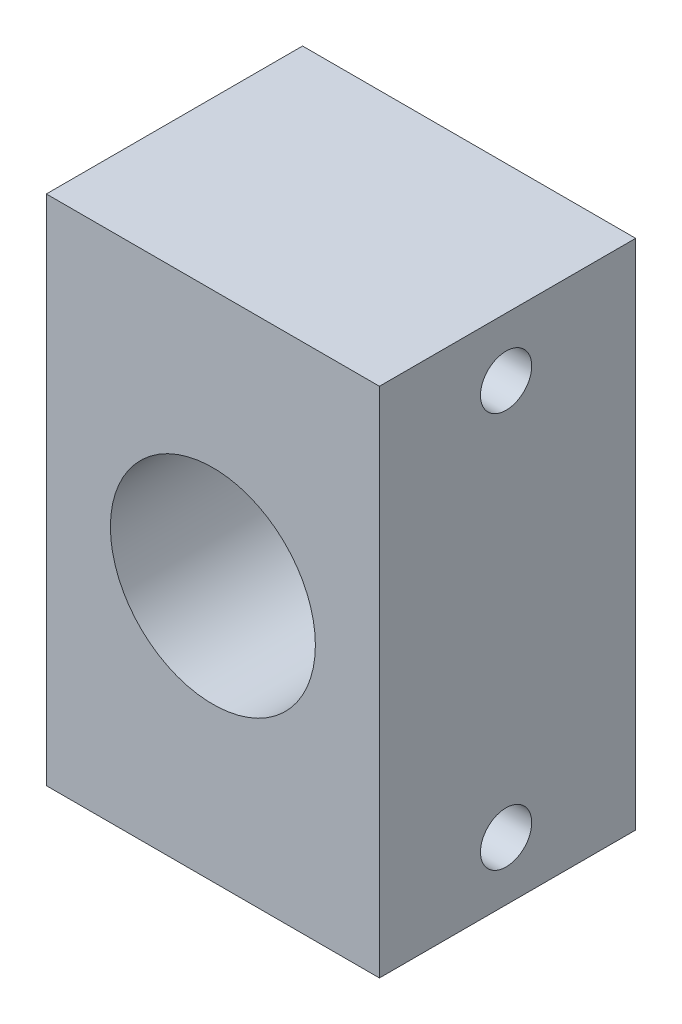
ISO-10303-21;
HEADER;
FILE_DESCRIPTION(('STEP AP214'),'2;1');
FILE_NAME('part.step','',(''),(''),'','','');
FILE_SCHEMA(('AUTOMOTIVE_DESIGN { 1 0 10303 214 1 1 1 1 }'));
ENDSEC;
DATA;
#1=APPLICATION_CONTEXT('core data for automotive mechanical design processes');
#2=APPLICATION_PROTOCOL_DEFINITION('international standard','automotive_design',2000,#1);
#3=PRODUCT_CONTEXT('',#1,'mechanical');
#4=PRODUCT('Part','Part','',(#3));
#5=PRODUCT_RELATED_PRODUCT_CATEGORY('part','',(#4));
#6=PRODUCT_DEFINITION_FORMATION('','',#4);
#7=PRODUCT_DEFINITION_CONTEXT('part definition',#1,'design');
#8=PRODUCT_DEFINITION('design','',#6,#7);
#9=PRODUCT_DEFINITION_SHAPE('','',#8);
#10=(LENGTH_UNIT() NAMED_UNIT(*) SI_UNIT(.MILLI.,.METRE.));
#11=(NAMED_UNIT(*) PLANE_ANGLE_UNIT() SI_UNIT($,.RADIAN.));
#12=(NAMED_UNIT(*) SI_UNIT($,.STERADIAN.) SOLID_ANGLE_UNIT());
#13=UNCERTAINTY_MEASURE_WITH_UNIT(LENGTH_MEASURE(1.E-05),#10,'distance_accuracy_value','');
#14=(GEOMETRIC_REPRESENTATION_CONTEXT(3) GLOBAL_UNCERTAINTY_ASSIGNED_CONTEXT((#13)) GLOBAL_UNIT_ASSIGNED_CONTEXT((#10,
#11,#12)) REPRESENTATION_CONTEXT('',''));
#15=CARTESIAN_POINT('',(0.,0.,0.));
#16=DIRECTION('',(0.,0.,1.));
#17=DIRECTION('',(1.,0.,0.));
#18=AXIS2_PLACEMENT_3D('',#15,#16,#17);
#19=CARTESIAN_POINT('',(0.,0.,10.));
#20=DIRECTION('',(0.,0.,1.));
#21=DIRECTION('',(1.,0.,0.));
#22=AXIS2_PLACEMENT_3D('',#19,#20,#21);
#23=PLANE('',#22);
#24=DIRECTION('',(0.,-1.,0.));
#25=VECTOR('',#24,1.);
#26=CARTESIAN_POINT('',(-6.5,-10.,10.));
#27=LINE('',#26,#25);
#28=CARTESIAN_POINT('',(-6.5,10.,10.));
#29=VERTEX_POINT('',#28);
#30=CARTESIAN_POINT('',(-6.5,-10.,10.));
#31=VERTEX_POINT('',#30);
#32=EDGE_CURVE('E87',#29,#31,#27,.T.);
#33=ORIENTED_EDGE('',*,*,#32,.T.);
#34=DIRECTION('',(1.,0.,0.));
#35=VECTOR('',#34,1.);
#36=CARTESIAN_POINT('',(6.5,-10.,10.));
#37=LINE('',#36,#35);
#38=CARTESIAN_POINT('',(6.5,-10.,10.));
#39=VERTEX_POINT('',#38);
#40=EDGE_CURVE('E82',#31,#39,#37,.T.);
#41=ORIENTED_EDGE('',*,*,#40,.T.);
#42=DIRECTION('',(0.,1.,0.));
#43=VECTOR('',#42,1.);
#44=CARTESIAN_POINT('',(6.5,-10.,10.));
#45=LINE('',#44,#43);
#46=CARTESIAN_POINT('',(6.5,10.,10.));
#47=VERTEX_POINT('',#46);
#48=EDGE_CURVE('E85',#39,#47,#45,.T.);
#49=ORIENTED_EDGE('',*,*,#48,.T.);
#50=DIRECTION('',(-1.,0.,0.));
#51=VECTOR('',#50,1.);
#52=CARTESIAN_POINT('',(6.5,10.,10.));
#53=LINE('',#52,#51);
#54=EDGE_CURVE('E52',#47,#29,#53,.T.);
#55=ORIENTED_EDGE('',*,*,#54,.T.);
#56=EDGE_LOOP('',(#33,#41,#49,#55));
#57=FACE_BOUND('',#56,.T.);
#58=CARTESIAN_POINT('',(0.,0.,10.));
#59=DIRECTION('',(0.,0.,1.));
#60=DIRECTION('',(1.,0.,0.));
#61=AXIS2_PLACEMENT_3D('',#58,#59,#60);
#62=CIRCLE('',#61,4.);
#63=CARTESIAN_POINT('',(4.,0.,10.));
#64=VERTEX_POINT('',#63);
#65=EDGE_CURVE('E102',#64,#64,#62,.T.);
#66=ORIENTED_EDGE('',*,*,#65,.F.);
#67=EDGE_LOOP('',(#66));
#68=FACE_BOUND('',#67,.T.);
#69=ADVANCED_FACE('F35',(#57,#68),#23,.T.);
#70=CARTESIAN_POINT('',(0.,0.,0.));
#71=DIRECTION('',(0.,0.,1.));
#72=DIRECTION('',(1.,0.,0.));
#73=AXIS2_PLACEMENT_3D('',#70,#71,#72);
#74=PLANE('',#73);
#75=DIRECTION('',(0.,-1.,0.));
#76=VECTOR('',#75,1.);
#77=CARTESIAN_POINT('',(-6.5,-10.,0.));
#78=LINE('',#77,#76);
#79=CARTESIAN_POINT('',(-6.5,10.,0.));
#80=VERTEX_POINT('',#79);
#81=CARTESIAN_POINT('',(-6.5,-10.,0.));
#82=VERTEX_POINT('',#81);
#83=EDGE_CURVE('E99',#80,#82,#78,.T.);
#84=ORIENTED_EDGE('',*,*,#83,.F.);
#85=DIRECTION('',(-1.,0.,0.));
#86=VECTOR('',#85,1.);
#87=CARTESIAN_POINT('',(6.5,10.,0.));
#88=LINE('',#87,#86);
#89=CARTESIAN_POINT('',(6.5,10.,0.));
#90=VERTEX_POINT('',#89);
#91=EDGE_CURVE('E75',#90,#80,#88,.T.);
#92=ORIENTED_EDGE('',*,*,#91,.F.);
#93=DIRECTION('',(0.,1.,0.));
#94=VECTOR('',#93,1.);
#95=CARTESIAN_POINT('',(6.5,-10.,0.));
#96=LINE('',#95,#94);
#97=CARTESIAN_POINT('',(6.5,-10.,0.));
#98=VERTEX_POINT('',#97);
#99=EDGE_CURVE('E69',#98,#90,#96,.T.);
#100=ORIENTED_EDGE('',*,*,#99,.F.);
#101=DIRECTION('',(1.,0.,0.));
#102=VECTOR('',#101,1.);
#103=CARTESIAN_POINT('',(6.5,-10.,0.));
#104=LINE('',#103,#102);
#105=EDGE_CURVE('E91',#82,#98,#104,.T.);
#106=ORIENTED_EDGE('',*,*,#105,.F.);
#107=EDGE_LOOP('',(#84,#92,#100,#106));
#108=FACE_BOUND('',#107,.T.);
#109=CARTESIAN_POINT('',(0.,0.,0.));
#110=DIRECTION('',(0.,0.,1.));
#111=DIRECTION('',(1.,0.,0.));
#112=AXIS2_PLACEMENT_3D('',#109,#110,#111);
#113=CIRCLE('',#112,4.);
#114=CARTESIAN_POINT('',(4.,0.,0.));
#115=VERTEX_POINT('',#114);
#116=EDGE_CURVE('E114',#115,#115,#113,.T.);
#117=ORIENTED_EDGE('',*,*,#116,.T.);
#118=EDGE_LOOP('',(#117));
#119=FACE_BOUND('',#118,.T.);
#120=ADVANCED_FACE('F110',(#108,#119),#74,.F.);
#121=CARTESIAN_POINT('',(-6.5,-10.,10.));
#122=DIRECTION('',(1.,0.,0.));
#123=DIRECTION('',(0.,0.,-1.));
#124=AXIS2_PLACEMENT_3D('',#121,#122,#123);
#125=PLANE('',#124);
#126=CARTESIAN_POINT('',(-6.5,-7.71818052572826,5.05757393443673));
#127=DIRECTION('',(-1.,0.,0.));
#128=DIRECTION('',(0.,0.,-1.));
#129=AXIS2_PLACEMENT_3D('',#126,#127,#128);
#130=CIRCLE('',#129,1.);
#131=CARTESIAN_POINT('',(-6.5,-7.71818052572826,4.05757393443673));
#132=VERTEX_POINT('',#131);
#133=EDGE_CURVE('E123',#132,#132,#130,.T.);
#134=ORIENTED_EDGE('',*,*,#133,.F.);
#135=EDGE_LOOP('',(#134));
#136=FACE_BOUND('',#135,.T.);
#137=CARTESIAN_POINT('',(-6.5,7.71818052572826,5.05757393443673));
#138=DIRECTION('',(1.,0.,0.));
#139=DIRECTION('',(0.,0.,-1.));
#140=AXIS2_PLACEMENT_3D('',#137,#138,#139);
#141=CIRCLE('',#140,1.);
#142=CARTESIAN_POINT('',(-6.5,7.71818052572826,4.05757393443673));
#143=VERTEX_POINT('',#142);
#144=EDGE_CURVE('E117',#143,#143,#141,.T.);
#145=ORIENTED_EDGE('',*,*,#144,.T.);
#146=EDGE_LOOP('',(#145));
#147=FACE_BOUND('',#146,.T.);
#148=ORIENTED_EDGE('',*,*,#83,.T.);
#149=DIRECTION('',(0.,0.,-1.));
#150=VECTOR('',#149,1.);
#151=CARTESIAN_POINT('',(-6.5,-10.,10.));
#152=LINE('',#151,#150);
#153=EDGE_CURVE('E11',#31,#82,#152,.T.);
#154=ORIENTED_EDGE('',*,*,#153,.F.);
#155=ORIENTED_EDGE('',*,*,#32,.F.);
#156=DIRECTION('',(0.,0.,-1.));
#157=VECTOR('',#156,1.);
#158=CARTESIAN_POINT('',(-6.5,10.,10.));
#159=LINE('',#158,#157);
#160=EDGE_CURVE('E95',#29,#80,#159,.T.);
#161=ORIENTED_EDGE('',*,*,#160,.T.);
#162=EDGE_LOOP('',(#148,#154,#155,#161));
#163=FACE_BOUND('',#162,.T.);
#164=ADVANCED_FACE('F37',(#136,#147,#163),#125,.F.);
#165=CARTESIAN_POINT('',(6.5,-10.,10.));
#166=DIRECTION('',(0.,1.,0.));
#167=DIRECTION('',(-1.,0.,0.));
#168=AXIS2_PLACEMENT_3D('',#165,#166,#167);
#169=PLANE('',#168);
#170=ORIENTED_EDGE('',*,*,#105,.T.);
#171=DIRECTION('',(0.,0.,-1.));
#172=VECTOR('',#171,1.);
#173=CARTESIAN_POINT('',(6.5,-10.,10.));
#174=LINE('',#173,#172);
#175=EDGE_CURVE('E44',#39,#98,#174,.T.);
#176=ORIENTED_EDGE('',*,*,#175,.F.);
#177=ORIENTED_EDGE('',*,*,#40,.F.);
#178=ORIENTED_EDGE('',*,*,#153,.T.);
#179=EDGE_LOOP('',(#170,#176,#177,#178));
#180=FACE_BOUND('',#179,.T.);
#181=ADVANCED_FACE('F90',(#180),#169,.F.);
#182=CARTESIAN_POINT('',(6.5,-10.,10.));
#183=DIRECTION('',(-1.,0.,0.));
#184=DIRECTION('',(0.,0.,1.));
#185=AXIS2_PLACEMENT_3D('',#182,#183,#184);
#186=PLANE('',#185);
#187=CARTESIAN_POINT('',(6.5,-7.71818052572826,5.05757393443673));
#188=DIRECTION('',(-1.,0.,0.));
#189=DIRECTION('',(0.,0.,-1.));
#190=AXIS2_PLACEMENT_3D('',#187,#188,#189);
#191=CIRCLE('',#190,1.);
#192=CARTESIAN_POINT('',(6.5,-7.71818052572826,4.05757393443673));
#193=VERTEX_POINT('',#192);
#194=EDGE_CURVE('E126',#193,#193,#191,.T.);
#195=ORIENTED_EDGE('',*,*,#194,.T.);
#196=EDGE_LOOP('',(#195));
#197=FACE_BOUND('',#196,.T.);
#198=CARTESIAN_POINT('',(6.5,7.71818052572826,5.05757393443673));
#199=DIRECTION('',(1.,0.,0.));
#200=DIRECTION('',(0.,0.,-1.));
#201=AXIS2_PLACEMENT_3D('',#198,#199,#200);
#202=CIRCLE('',#201,1.);
#203=CARTESIAN_POINT('',(6.5,7.71818052572826,4.05757393443673));
#204=VERTEX_POINT('',#203);
#205=EDGE_CURVE('E120',#204,#204,#202,.T.);
#206=ORIENTED_EDGE('',*,*,#205,.F.);
#207=EDGE_LOOP('',(#206));
#208=FACE_BOUND('',#207,.T.);
#209=ORIENTED_EDGE('',*,*,#99,.T.);
#210=DIRECTION('',(0.,0.,-1.));
#211=VECTOR('',#210,1.);
#212=CARTESIAN_POINT('',(6.5,10.,10.));
#213=LINE('',#212,#211);
#214=EDGE_CURVE('E92',#47,#90,#213,.T.);
#215=ORIENTED_EDGE('',*,*,#214,.F.);
#216=ORIENTED_EDGE('',*,*,#48,.F.);
#217=ORIENTED_EDGE('',*,*,#175,.T.);
#218=EDGE_LOOP('',(#209,#215,#216,#217));
#219=FACE_BOUND('',#218,.T.);
#220=ADVANCED_FACE('F93',(#197,#208,#219),#186,.F.);
#221=CARTESIAN_POINT('',(6.5,10.,10.));
#222=DIRECTION('',(0.,-1.,0.));
#223=DIRECTION('',(1.,0.,0.));
#224=AXIS2_PLACEMENT_3D('',#221,#222,#223);
#225=PLANE('',#224);
#226=ORIENTED_EDGE('',*,*,#91,.T.);
#227=ORIENTED_EDGE('',*,*,#160,.F.);
#228=ORIENTED_EDGE('',*,*,#54,.F.);
#229=ORIENTED_EDGE('',*,*,#214,.T.);
#230=EDGE_LOOP('',(#226,#227,#228,#229));
#231=FACE_BOUND('',#230,.T.);
#232=ADVANCED_FACE('F107',(#231),#225,.F.);
#233=CARTESIAN_POINT('',(0.,0.,10.));
#234=DIRECTION('',(0.,0.,-1.));
#235=DIRECTION('',(-1.,0.,0.));
#236=AXIS2_PLACEMENT_3D('',#233,#234,#235);
#237=CYLINDRICAL_SURFACE('',#236,4.);
#238=ORIENTED_EDGE('',*,*,#65,.T.);
#239=EDGE_LOOP('',(#238));
#240=FACE_BOUND('',#239,.T.);
#241=ORIENTED_EDGE('',*,*,#116,.F.);
#242=EDGE_LOOP('',(#241));
#243=FACE_BOUND('',#242,.T.);
#244=ADVANCED_FACE('F142',(#240,#243),#237,.F.);
#245=CARTESIAN_POINT('',(-6.5,7.71818052572826,5.05757393443673));
#246=DIRECTION('',(1.,0.,0.));
#247=DIRECTION('',(0.,0.,-1.));
#248=AXIS2_PLACEMENT_3D('',#245,#246,#247);
#249=CYLINDRICAL_SURFACE('',#248,1.);
#250=CARTESIAN_POINT('',(-6.5,7.71818052572826,4.05757393443673));
#251=CARTESIAN_POINT('',(-6.36458333333333,7.71818052572826,4.05757393443673));
#252=CARTESIAN_POINT('',(-6.22916666666667,7.71818052572826,4.05757393443673));
#253=CARTESIAN_POINT('',(-5.95833333333333,7.71818052572826,4.05757393443673));
#254=CARTESIAN_POINT('',(-5.82291666666667,7.71818052572826,4.05757393443673));
#255=CARTESIAN_POINT('',(-5.55208333333333,7.71818052572826,4.05757393443673));
#256=CARTESIAN_POINT('',(-5.41666666666667,7.71818052572826,4.05757393443673));
#257=CARTESIAN_POINT('',(-5.14583333333333,7.71818052572826,4.05757393443673));
#258=CARTESIAN_POINT('',(-5.01041666666667,7.71818052572826,4.05757393443673));
#259=CARTESIAN_POINT('',(-4.73958333333333,7.71818052572826,4.05757393443673));
#260=CARTESIAN_POINT('',(-4.60416666666667,7.71818052572826,4.05757393443673));
#261=CARTESIAN_POINT('',(-4.33333333333333,7.71818052572826,4.05757393443673));
#262=CARTESIAN_POINT('',(-4.19791666666667,7.71818052572826,4.05757393443673));
#263=CARTESIAN_POINT('',(-3.92708333333333,7.71818052572826,4.05757393443673));
#264=CARTESIAN_POINT('',(-3.79166666666667,7.71818052572826,4.05757393443673));
#265=CARTESIAN_POINT('',(-3.52083333333333,7.71818052572826,4.05757393443673));
#266=CARTESIAN_POINT('',(-3.38541666666667,7.71818052572826,4.05757393443673));
#267=CARTESIAN_POINT('',(-3.11458333333333,7.71818052572826,4.05757393443673));
#268=CARTESIAN_POINT('',(-2.97916666666667,7.71818052572826,4.05757393443673));
#269=CARTESIAN_POINT('',(-2.70833333333333,7.71818052572826,4.05757393443673));
#270=CARTESIAN_POINT('',(-2.57291666666667,7.71818052572826,4.05757393443673));
#271=CARTESIAN_POINT('',(-2.30208333333333,7.71818052572826,4.05757393443673));
#272=CARTESIAN_POINT('',(-2.16666666666667,7.71818052572826,4.05757393443673));
#273=CARTESIAN_POINT('',(-1.89583333333333,7.71818052572826,4.05757393443673));
#274=CARTESIAN_POINT('',(-1.76041666666667,7.71818052572826,4.05757393443673));
#275=CARTESIAN_POINT('',(-1.48958333333333,7.71818052572826,4.05757393443673));
#276=CARTESIAN_POINT('',(-1.35416666666667,7.71818052572826,4.05757393443673));
#277=CARTESIAN_POINT('',(-1.08333333333333,7.71818052572826,4.05757393443673));
#278=CARTESIAN_POINT('',(-0.947916666666668,7.71818052572826,4.05757393443673));
#279=CARTESIAN_POINT('',(-0.677083333333334,7.71818052572826,4.05757393443673));
#280=CARTESIAN_POINT('',(-0.541666666666668,7.71818052572826,4.05757393443673));
#281=CARTESIAN_POINT('',(-0.270833333333334,7.71818052572826,4.05757393443673));
#282=CARTESIAN_POINT('',(-0.135416666666668,7.71818052572826,4.05757393443673));
#283=CARTESIAN_POINT('',(0.135416666666666,7.71818052572826,4.05757393443673));
#284=CARTESIAN_POINT('',(0.270833333333333,7.71818052572826,4.05757393443673));
#285=CARTESIAN_POINT('',(0.541666666666666,7.71818052572826,4.05757393443673));
#286=CARTESIAN_POINT('',(0.677083333333332,7.71818052572826,4.05757393443673));
#287=CARTESIAN_POINT('',(0.947916666666666,7.71818052572826,4.05757393443673));
#288=CARTESIAN_POINT('',(1.08333333333333,7.71818052572826,4.05757393443673));
#289=CARTESIAN_POINT('',(1.35416666666667,7.71818052572826,4.05757393443673));
#290=CARTESIAN_POINT('',(1.48958333333333,7.71818052572826,4.05757393443673));
#291=CARTESIAN_POINT('',(1.76041666666667,7.71818052572826,4.05757393443673));
#292=CARTESIAN_POINT('',(1.89583333333333,7.71818052572826,4.05757393443673));
#293=CARTESIAN_POINT('',(2.16666666666667,7.71818052572826,4.05757393443673));
#294=CARTESIAN_POINT('',(2.30208333333333,7.71818052572826,4.05757393443673));
#295=CARTESIAN_POINT('',(2.57291666666667,7.71818052572826,4.05757393443673));
#296=CARTESIAN_POINT('',(2.70833333333333,7.71818052572826,4.05757393443673));
#297=CARTESIAN_POINT('',(2.97916666666667,7.71818052572826,4.05757393443673));
#298=CARTESIAN_POINT('',(3.11458333333333,7.71818052572826,4.05757393443673));
#299=CARTESIAN_POINT('',(3.38541666666667,7.71818052572826,4.05757393443673));
#300=CARTESIAN_POINT('',(3.52083333333333,7.71818052572826,4.05757393443673));
#301=CARTESIAN_POINT('',(3.79166666666667,7.71818052572826,4.05757393443673));
#302=CARTESIAN_POINT('',(3.92708333333333,7.71818052572826,4.05757393443673));
#303=CARTESIAN_POINT('',(4.19791666666667,7.71818052572826,4.05757393443673));
#304=CARTESIAN_POINT('',(4.33333333333333,7.71818052572826,4.05757393443673));
#305=CARTESIAN_POINT('',(4.60416666666667,7.71818052572826,4.05757393443673));
#306=CARTESIAN_POINT('',(4.73958333333333,7.71818052572826,4.05757393443673));
#307=CARTESIAN_POINT('',(5.01041666666667,7.71818052572826,4.05757393443673));
#308=CARTESIAN_POINT('',(5.14583333333333,7.71818052572826,4.05757393443673));
#309=CARTESIAN_POINT('',(5.41666666666667,7.71818052572826,4.05757393443673));
#310=CARTESIAN_POINT('',(5.55208333333333,7.71818052572826,4.05757393443673));
#311=CARTESIAN_POINT('',(5.82291666666667,7.71818052572826,4.05757393443673));
#312=CARTESIAN_POINT('',(5.95833333333333,7.71818052572826,4.05757393443673));
#313=CARTESIAN_POINT('',(6.22916666666667,7.71818052572826,4.05757393443673));
#314=CARTESIAN_POINT('',(6.36458333333333,7.71818052572826,4.05757393443673));
#315=CARTESIAN_POINT('',(6.5,7.71818052572826,4.05757393443673));
#316=B_SPLINE_CURVE_WITH_KNOTS('',3,(#250,#251,#252,#253,#254,#255,#256,#257,#258,#259,#260,
#261,#262,#263,#264,#265,#266,#267,#268,#269,#270,#271,#272,#273,#274,#275,#276,#277,#278,#279,
#280,#281,#282,#283,#284,#285,#286,#287,#288,#289,#290,#291,#292,#293,#294,#295,#296,#297,#298,
#299,#300,#301,#302,#303,#304,#305,#306,#307,#308,#309,#310,#311,#312,#313,#314,#315),
.UNSPECIFIED.,.F.,.F.,(4,2,2,2,2,2,2,2,2,2,2,2,2,2,2,2,2,2,2,2,2,2,2,2,2,2,2,2,2,2,2,2,4),(0.,
0.40625,0.812500000000001,1.21875,1.625,2.03125,2.4375,2.84375,3.25,3.65625,4.0625,4.46875,
4.875,5.28125,5.6875,6.09375,6.5,6.90625,7.3125,7.71875,8.125,8.53125,8.9375,9.34375,9.75,
10.15625,10.5625,10.96875,11.375,11.78125,12.1875,12.59375,13.),.UNSPECIFIED.);
#317=EDGE_CURVE('BSEAM139',#143,#204,#316,.T.);
#318=ORIENTED_EDGE('',*,*,#144,.F.);
#319=ORIENTED_EDGE('',*,*,#205,.T.);
#320=ORIENTED_EDGE('',*,*,#317,.T.);
#321=ORIENTED_EDGE('',*,*,#317,.F.);
#322=EDGE_LOOP('',(#318,#320,#319,#321));
#323=FACE_BOUND('',#322,.T.);
#324=ADVANCED_FACE('F139',(#323),#249,.F.);
#325=CARTESIAN_POINT('',(-6.5,-7.71818052572826,5.05757393443673));
#326=DIRECTION('',(1.,0.,0.));
#327=DIRECTION('',(0.,1.,0.));
#328=AXIS2_PLACEMENT_3D('',#325,#326,#327);
#329=CYLINDRICAL_SURFACE('',#328,1.);
#330=ORIENTED_EDGE('',*,*,#133,.T.);
#331=EDGE_LOOP('',(#330));
#332=FACE_BOUND('',#331,.T.);
#333=ORIENTED_EDGE('',*,*,#194,.F.);
#334=EDGE_LOOP('',(#333));
#335=FACE_BOUND('',#334,.T.);
#336=ADVANCED_FACE('F132',(#332,#335),#329,.F.);
#337=CLOSED_SHELL('',(#69,#120,#164,#181,#220,#232,#244,#324,#336));
#338=MANIFOLD_SOLID_BREP('B2',#337);
#339=ADVANCED_BREP_SHAPE_REPRESENTATION('',(#18,#338),#14);
#340=SHAPE_DEFINITION_REPRESENTATION(#9,#339);
ENDSEC;
END-ISO-10303-21;
